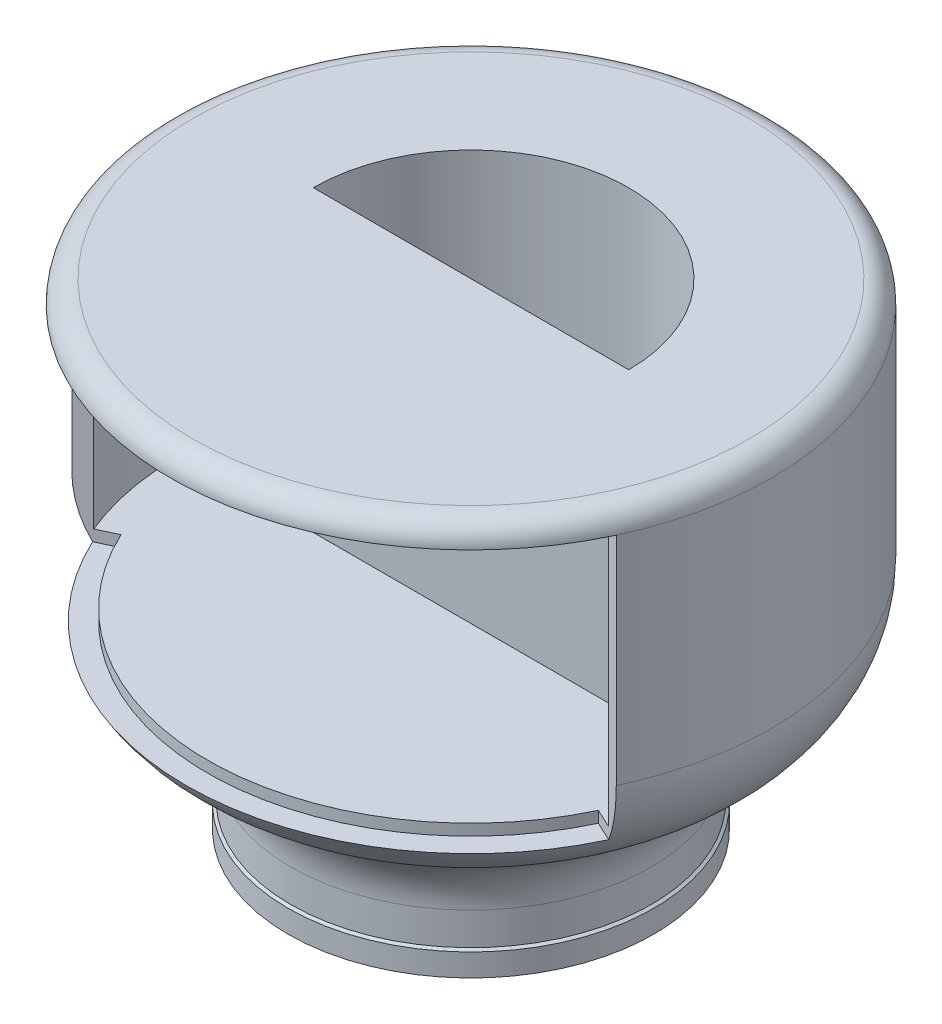
ISO-10303-21;
HEADER;
FILE_DESCRIPTION(('STEP AP214'),'2;1');
FILE_NAME('part.step','',(''),(''),'','','');
FILE_SCHEMA(('AUTOMOTIVE_DESIGN { 1 0 10303 214 1 1 1 1 }'));
ENDSEC;
DATA;
#1=APPLICATION_CONTEXT('core data for automotive mechanical design processes');
#2=APPLICATION_PROTOCOL_DEFINITION('international standard','automotive_design',2000,#1);
#3=PRODUCT_CONTEXT('',#1,'mechanical');
#4=PRODUCT('Part','Part','',(#3));
#5=PRODUCT_RELATED_PRODUCT_CATEGORY('part','',(#4));
#6=PRODUCT_DEFINITION_FORMATION('','',#4);
#7=PRODUCT_DEFINITION_CONTEXT('part definition',#1,'design');
#8=PRODUCT_DEFINITION('design','',#6,#7);
#9=PRODUCT_DEFINITION_SHAPE('','',#8);
#10=(LENGTH_UNIT() NAMED_UNIT(*) SI_UNIT(.MILLI.,.METRE.));
#11=(NAMED_UNIT(*) PLANE_ANGLE_UNIT() SI_UNIT($,.RADIAN.));
#12=(NAMED_UNIT(*) SI_UNIT($,.STERADIAN.) SOLID_ANGLE_UNIT());
#13=UNCERTAINTY_MEASURE_WITH_UNIT(LENGTH_MEASURE(1.E-05),#10,'distance_accuracy_value','');
#14=(GEOMETRIC_REPRESENTATION_CONTEXT(3) GLOBAL_UNCERTAINTY_ASSIGNED_CONTEXT((#13)) GLOBAL_UNIT_ASSIGNED_CONTEXT((#10,
#11,#12)) REPRESENTATION_CONTEXT('',''));
#15=CARTESIAN_POINT('',(0.,0.,0.));
#16=DIRECTION('',(0.,0.,1.));
#17=DIRECTION('',(1.,0.,0.));
#18=AXIS2_PLACEMENT_3D('',#15,#16,#17);
#19=CARTESIAN_POINT('',(0.,31.5562889655761,0.));
#20=DIRECTION('',(0.,-1.,0.));
#21=DIRECTION('',(0.,0.,-1.));
#22=AXIS2_PLACEMENT_3D('',#19,#20,#21);
#23=TOROIDAL_SURFACE('',#22,25.,15.);
#24=CARTESIAN_POINT('',(0.,18.9896485668923,0.));
#25=DIRECTION('',(0.,-1.,0.));
#26=DIRECTION('',(0.,0.,-1.));
#27=AXIS2_PLACEMENT_3D('',#24,#25,#26);
#28=CIRCLE('',#27,33.1902105644586);
#29=CARTESIAN_POINT('',(0.,18.9896485668923,-33.1902105644586));
#30=VERTEX_POINT('',#29);
#31=EDGE_CURVE('E245',#30,#30,#28,.T.);
#32=ORIENTED_EDGE('',*,*,#31,.F.);
#33=EDGE_LOOP('',(#32));
#34=FACE_BOUND('',#33,.T.);
#35=CARTESIAN_POINT('',(0.,31.5562889655761,0.));
#36=DIRECTION('',(0.,-1.,0.));
#37=DIRECTION('',(0.,0.,-1.));
#38=AXIS2_PLACEMENT_3D('',#35,#36,#37);
#39=CIRCLE('',#38,40.);
#40=CARTESIAN_POINT('',(-36.2523114814661,31.5562889655761,16.9047304696279));
#41=VERTEX_POINT('',#40);
#42=CARTESIAN_POINT('',(36.252311481466,31.5562889655761,16.9047304696279));
#43=VERTEX_POINT('',#42);
#44=EDGE_CURVE('E249',#41,#43,#39,.T.);
#45=ORIENTED_EDGE('',*,*,#44,.T.);
#46=CARTESIAN_POINT('',(22.6576946759163,31.5562889655761,10.5654565435174));
#47=DIRECTION('',(-0.422618261740697,0.,0.906307787036651));
#48=DIRECTION('',(0.906307787036651,0.,0.422618261740697));
#49=AXIS2_PLACEMENT_3D('',#46,#47,#48);
#50=CIRCLE('',#49,15.);
#51=CARTESIAN_POINT('',(34.3630138459412,23.9278760968653,16.0237365136485));
#52=VERTEX_POINT('',#51);
#53=EDGE_CURVE('E174',#43,#52,#50,.F.);
#54=ORIENTED_EDGE('',*,*,#53,.T.);
#55=CARTESIAN_POINT('',(0.,23.9278760968653,0.));
#56=DIRECTION('',(0.,-1.,0.));
#57=DIRECTION('',(0.,0.,-1.));
#58=AXIS2_PLACEMENT_3D('',#55,#56,#57);
#59=CIRCLE('',#58,37.9153907066139);
#60=CARTESIAN_POINT('',(-34.3630138459412,23.9278760968653,16.0237365136485));
#61=VERTEX_POINT('',#60);
#62=EDGE_CURVE('E11',#61,#52,#59,.F.);
#63=ORIENTED_EDGE('',*,*,#62,.F.);
#64=CARTESIAN_POINT('',(-22.6576946759163,31.5562889655761,10.5654565435174));
#65=DIRECTION('',(-0.422618261740697,0.,-0.906307787036651));
#66=DIRECTION('',(-0.906307787036651,0.,0.422618261740697));
#67=AXIS2_PLACEMENT_3D('',#64,#65,#66);
#68=CIRCLE('',#67,15.);
#69=EDGE_CURVE('E145',#41,#61,#68,.F.);
#70=ORIENTED_EDGE('',*,*,#69,.F.);
#71=EDGE_LOOP('',(#45,#54,#63,#70));
#72=FACE_BOUND('',#71,.T.);
#73=ADVANCED_FACE('F41',(#34,#72),#23,.T.);
#74=CARTESIAN_POINT('',(0.,0.,0.));
#75=DIRECTION('',(0.,-1.,0.));
#76=DIRECTION('',(0.,0.,-1.));
#77=AXIS2_PLACEMENT_3D('',#74,#75,#76);
#78=CYLINDRICAL_SURFACE('',#77,40.);
#79=CARTESIAN_POINT('',(0.,60.4278760968653,0.));
#80=DIRECTION('',(0.,-1.,0.));
#81=DIRECTION('',(0.,0.,-1.));
#82=AXIS2_PLACEMENT_3D('',#79,#80,#81);
#83=CIRCLE('',#82,40.);
#84=CARTESIAN_POINT('',(-36.252311481466,60.4278760968653,16.9047304696279));
#85=VERTEX_POINT('',#84);
#86=CARTESIAN_POINT('',(36.252311481466,60.4278760968653,16.9047304696279));
#87=VERTEX_POINT('',#86);
#88=EDGE_CURVE('E253',#85,#87,#83,.T.);
#89=ORIENTED_EDGE('',*,*,#88,.T.);
#90=DIRECTION('',(0.,-1.,0.));
#91=VECTOR('',#90,1.);
#92=CARTESIAN_POINT('',(36.252311481466,0.,16.9047304696279));
#93=LINE('',#92,#91);
#94=EDGE_CURVE('E170',#87,#43,#93,.T.);
#95=ORIENTED_EDGE('',*,*,#94,.T.);
#96=ORIENTED_EDGE('',*,*,#44,.F.);
#97=DIRECTION('',(0.,-1.,0.));
#98=VECTOR('',#97,1.);
#99=CARTESIAN_POINT('',(-36.2523114814661,0.,16.9047304696279));
#100=LINE('',#99,#98);
#101=EDGE_CURVE('E161',#85,#41,#100,.T.);
#102=ORIENTED_EDGE('',*,*,#101,.F.);
#103=EDGE_LOOP('',(#89,#95,#96,#102));
#104=FACE_BOUND('',#103,.T.);
#105=ADVANCED_FACE('F302',(#104),#78,.T.);
#106=CARTESIAN_POINT('',(0.,0.,0.));
#107=DIRECTION('',(0.,-1.,0.));
#108=DIRECTION('',(0.,0.,-1.));
#109=AXIS2_PLACEMENT_3D('',#106,#107,#108);
#110=CYLINDRICAL_SURFACE('',#109,22.5);
#111=CARTESIAN_POINT('',(0.,0.,0.));
#112=DIRECTION('',(0.,-1.,0.));
#113=DIRECTION('',(0.,0.,-1.));
#114=AXIS2_PLACEMENT_3D('',#111,#112,#113);
#115=CIRCLE('',#114,22.5);
#116=CARTESIAN_POINT('',(0.,0.,-22.5));
#117=VERTEX_POINT('',#116);
#118=EDGE_CURVE('E218',#117,#117,#115,.T.);
#119=ORIENTED_EDGE('',*,*,#118,.T.);
#120=EDGE_LOOP('',(#119));
#121=FACE_BOUND('',#120,.T.);
#122=CARTESIAN_POINT('',(0.,12.5,0.));
#123=DIRECTION('',(0.,-1.,0.));
#124=DIRECTION('',(0.,0.,-1.));
#125=AXIS2_PLACEMENT_3D('',#122,#123,#124);
#126=CIRCLE('',#125,22.5);
#127=CARTESIAN_POINT('',(0.,12.5,-22.5));
#128=VERTEX_POINT('',#127);
#129=EDGE_CURVE('E265',#128,#128,#126,.T.);
#130=ORIENTED_EDGE('',*,*,#129,.F.);
#131=EDGE_LOOP('',(#130));
#132=FACE_BOUND('',#131,.T.);
#133=ADVANCED_FACE('F43',(#121,#132),#110,.F.);
#134=CARTESIAN_POINT('',(0.,12.5,0.));
#135=DIRECTION('',(0.,-1.,0.));
#136=DIRECTION('',(0.,0.,-1.));
#137=AXIS2_PLACEMENT_3D('',#134,#135,#136);
#138=TOROIDAL_SURFACE('',#137,22.,0.5);
#139=ORIENTED_EDGE('',*,*,#129,.T.);
#140=EDGE_LOOP('',(#139));
#141=FACE_BOUND('',#140,.T.);
#142=CARTESIAN_POINT('',(0.,13.,0.));
#143=DIRECTION('',(0.,-1.,0.));
#144=DIRECTION('',(0.,0.,-1.));
#145=AXIS2_PLACEMENT_3D('',#142,#143,#144);
#146=CIRCLE('',#145,22.);
#147=CARTESIAN_POINT('',(0.,13.,-22.));
#148=VERTEX_POINT('',#147);
#149=EDGE_CURVE('E261',#148,#148,#146,.T.);
#150=ORIENTED_EDGE('',*,*,#149,.F.);
#151=EDGE_LOOP('',(#150));
#152=FACE_BOUND('',#151,.T.);
#153=ADVANCED_FACE('F488',(#141,#152),#138,.F.);
#154=CARTESIAN_POINT('',(0.,13.,0.));
#155=DIRECTION('',(0.,-1.,0.));
#156=DIRECTION('',(0.,0.,-1.));
#157=AXIS2_PLACEMENT_3D('',#154,#155,#156);
#158=PLANE('',#157);
#159=CARTESIAN_POINT('',(0.,13.,0.));
#160=DIRECTION('',(0.,-1.,0.));
#161=DIRECTION('',(0.,0.,1.));
#162=AXIS2_PLACEMENT_3D('',#159,#160,#161);
#163=CIRCLE('',#162,21.);
#164=CARTESIAN_POINT('',(-21.,13.,0.));
#165=VERTEX_POINT('',#164);
#166=CARTESIAN_POINT('',(21.,13.,0.));
#167=VERTEX_POINT('',#166);
#168=EDGE_CURVE('E207',#165,#167,#163,.T.);
#169=ORIENTED_EDGE('',*,*,#168,.F.);
#170=DIRECTION('',(-1.,0.,0.));
#171=VECTOR('',#170,1.);
#172=CARTESIAN_POINT('',(21.,13.,0.));
#173=LINE('',#172,#171);
#174=EDGE_CURVE('E210',#167,#165,#173,.T.);
#175=ORIENTED_EDGE('',*,*,#174,.F.);
#176=EDGE_LOOP('',(#169,#175));
#177=FACE_BOUND('',#176,.T.);
#178=ORIENTED_EDGE('',*,*,#149,.T.);
#179=EDGE_LOOP('',(#178));
#180=FACE_BOUND('',#179,.T.);
#181=ADVANCED_FACE('F320',(#177,#180),#158,.T.);
#182=CARTESIAN_POINT('',(0.,63.4278760968653,0.));
#183=DIRECTION('',(0.,1.,0.));
#184=DIRECTION('',(0.,0.,1.));
#185=AXIS2_PLACEMENT_3D('',#182,#183,#184);
#186=PLANE('',#185);
#187=CARTESIAN_POINT('',(0.,63.4278760968653,0.));
#188=DIRECTION('',(0.,1.,0.));
#189=DIRECTION('',(0.,0.,1.));
#190=AXIS2_PLACEMENT_3D('',#187,#188,#189);
#191=CIRCLE('',#190,21.);
#192=CARTESIAN_POINT('',(21.,63.4278760968653,0.));
#193=VERTEX_POINT('',#192);
#194=CARTESIAN_POINT('',(-21.,63.4278760968653,0.));
#195=VERTEX_POINT('',#194);
#196=EDGE_CURVE('E272',#193,#195,#191,.T.);
#197=ORIENTED_EDGE('',*,*,#196,.F.);
#198=DIRECTION('',(1.,0.,0.));
#199=VECTOR('',#198,1.);
#200=CARTESIAN_POINT('',(0.,63.4278760968653,0.));
#201=LINE('',#200,#199);
#202=EDGE_CURVE('E269',#195,#193,#201,.T.);
#203=ORIENTED_EDGE('',*,*,#202,.F.);
#204=EDGE_LOOP('',(#197,#203));
#205=FACE_BOUND('',#204,.T.);
#206=CARTESIAN_POINT('',(0.,63.4278760968653,0.));
#207=DIRECTION('',(0.,-1.,0.));
#208=DIRECTION('',(0.,0.,-1.));
#209=AXIS2_PLACEMENT_3D('',#206,#207,#208);
#210=CIRCLE('',#209,37.);
#211=CARTESIAN_POINT('',(0.,63.4278760968653,-37.));
#212=VERTEX_POINT('',#211);
#213=EDGE_CURVE('E257',#212,#212,#210,.T.);
#214=ORIENTED_EDGE('',*,*,#213,.F.);
#215=EDGE_LOOP('',(#214));
#216=FACE_BOUND('',#215,.T.);
#217=ADVANCED_FACE('F310',(#205,#216),#186,.T.);
#218=CARTESIAN_POINT('',(0.,60.4278760968653,0.));
#219=DIRECTION('',(0.,-1.,0.));
#220=DIRECTION('',(0.,0.,-1.));
#221=AXIS2_PLACEMENT_3D('',#218,#219,#220);
#222=TOROIDAL_SURFACE('',#221,37.,3.);
#223=ORIENTED_EDGE('',*,*,#213,.T.);
#224=EDGE_LOOP('',(#223));
#225=FACE_BOUND('',#224,.T.);
#226=EDGE_CURVE('E254',#87,#85,#83,.T.);
#227=ORIENTED_EDGE('',*,*,#226,.F.);
#228=ORIENTED_EDGE('',*,*,#88,.F.);
#229=EDGE_LOOP('',(#227,#228));
#230=FACE_BOUND('',#229,.T.);
#231=ADVANCED_FACE('F307',(#225,#230),#222,.T.);
#232=CARTESIAN_POINT('',(0.,15.9588183533154,0.));
#233=DIRECTION('',(0.,1.,0.));
#234=DIRECTION('',(0.,0.,1.));
#235=AXIS2_PLACEMENT_3D('',#232,#233,#234);
#236=CONICAL_SURFACE('',#235,28.5398596236943,0.993197296529964);
#237=ORIENTED_EDGE('',*,*,#31,.T.);
#238=EDGE_LOOP('',(#237));
#239=FACE_BOUND('',#238,.T.);
#240=CARTESIAN_POINT('',(0.,15.9588183533154,0.));
#241=DIRECTION('',(0.,-1.,0.));
#242=DIRECTION('',(0.,0.,-1.));
#243=AXIS2_PLACEMENT_3D('',#240,#241,#242);
#244=CIRCLE('',#243,28.5398596236943);
#245=CARTESIAN_POINT('',(0.,15.9588183533154,-28.5398596236943));
#246=VERTEX_POINT('',#245);
#247=EDGE_CURVE('E241',#246,#246,#244,.T.);
#248=ORIENTED_EDGE('',*,*,#247,.F.);
#249=EDGE_LOOP('',(#248));
#250=FACE_BOUND('',#249,.T.);
#251=ADVANCED_FACE('F309',(#239,#250),#236,.T.);
#252=CARTESIAN_POINT('',(0.,7.58105808752617,0.));
#253=DIRECTION('',(0.,-1.,0.));
#254=DIRECTION('',(0.,0.,-1.));
#255=AXIS2_PLACEMENT_3D('',#252,#253,#254);
#256=TOROIDAL_SURFACE('',#255,34.,10.);
#257=ORIENTED_EDGE('',*,*,#247,.T.);
#258=EDGE_LOOP('',(#257));
#259=FACE_BOUND('',#258,.T.);
#260=CARTESIAN_POINT('',(0.,7.58105808752612,0.));
#261=DIRECTION('',(0.,-1.,0.));
#262=DIRECTION('',(0.,0.,-1.));
#263=AXIS2_PLACEMENT_3D('',#260,#261,#262);
#264=CIRCLE('',#263,24.);
#265=CARTESIAN_POINT('',(0.,7.58105808752612,-24.));
#266=VERTEX_POINT('',#265);
#267=EDGE_CURVE('E237',#266,#266,#264,.T.);
#268=ORIENTED_EDGE('',*,*,#267,.F.);
#269=EDGE_LOOP('',(#268));
#270=FACE_BOUND('',#269,.T.);
#271=ADVANCED_FACE('F317',(#259,#270),#256,.F.);
#272=CARTESIAN_POINT('',(0.,0.,0.));
#273=DIRECTION('',(0.,-1.,0.));
#274=DIRECTION('',(0.,0.,-1.));
#275=AXIS2_PLACEMENT_3D('',#272,#273,#274);
#276=CYLINDRICAL_SURFACE('',#275,24.);
#277=ORIENTED_EDGE('',*,*,#267,.T.);
#278=EDGE_LOOP('',(#277));
#279=FACE_BOUND('',#278,.T.);
#280=CARTESIAN_POINT('',(0.,3.25,0.));
#281=DIRECTION('',(0.,-1.,0.));
#282=DIRECTION('',(0.,0.,-1.));
#283=AXIS2_PLACEMENT_3D('',#280,#281,#282);
#284=CIRCLE('',#283,24.);
#285=CARTESIAN_POINT('',(0.,3.25,-24.));
#286=VERTEX_POINT('',#285);
#287=EDGE_CURVE('E233',#286,#286,#284,.T.);
#288=ORIENTED_EDGE('',*,*,#287,.F.);
#289=EDGE_LOOP('',(#288));
#290=FACE_BOUND('',#289,.T.);
#291=ADVANCED_FACE('F334',(#279,#290),#276,.T.);
#292=CARTESIAN_POINT('',(0.,3.,0.));
#293=DIRECTION('',(0.,-1.,0.));
#294=DIRECTION('',(0.,0.,-1.));
#295=AXIS2_PLACEMENT_3D('',#292,#293,#294);
#296=CONICAL_SURFACE('',#295,24.35,0.950546840812071);
#297=ORIENTED_EDGE('',*,*,#287,.T.);
#298=EDGE_LOOP('',(#297));
#299=FACE_BOUND('',#298,.T.);
#300=CARTESIAN_POINT('',(0.,3.,0.));
#301=DIRECTION('',(0.,-1.,0.));
#302=DIRECTION('',(0.,0.,-1.));
#303=AXIS2_PLACEMENT_3D('',#300,#301,#302);
#304=CIRCLE('',#303,24.35);
#305=CARTESIAN_POINT('',(0.,3.,-24.35));
#306=VERTEX_POINT('',#305);
#307=EDGE_CURVE('E229',#306,#306,#304,.T.);
#308=ORIENTED_EDGE('',*,*,#307,.F.);
#309=EDGE_LOOP('',(#308));
#310=FACE_BOUND('',#309,.T.);
#311=ADVANCED_FACE('F338',(#299,#310),#296,.T.);
#312=CARTESIAN_POINT('',(0.,0.,0.));
#313=DIRECTION('',(0.,-1.,0.));
#314=DIRECTION('',(0.,0.,-1.));
#315=AXIS2_PLACEMENT_3D('',#312,#313,#314);
#316=CYLINDRICAL_SURFACE('',#315,24.35);
#317=ORIENTED_EDGE('',*,*,#307,.T.);
#318=EDGE_LOOP('',(#317));
#319=FACE_BOUND('',#318,.T.);
#320=CARTESIAN_POINT('',(0.,0.,0.));
#321=DIRECTION('',(0.,-1.,0.));
#322=DIRECTION('',(0.,0.,-1.));
#323=AXIS2_PLACEMENT_3D('',#320,#321,#322);
#324=CIRCLE('',#323,24.35);
#325=CARTESIAN_POINT('',(0.,0.,-24.35));
#326=VERTEX_POINT('',#325);
#327=EDGE_CURVE('E225',#326,#326,#324,.T.);
#328=ORIENTED_EDGE('',*,*,#327,.F.);
#329=EDGE_LOOP('',(#328));
#330=FACE_BOUND('',#329,.T.);
#331=ADVANCED_FACE('F342',(#319,#330),#316,.T.);
#332=CARTESIAN_POINT('',(22.5,0.,0.));
#333=DIRECTION('',(0.,-1.,0.));
#334=DIRECTION('',(0.,0.,-1.));
#335=AXIS2_PLACEMENT_3D('',#332,#333,#334);
#336=PLANE('',#335);
#337=ORIENTED_EDGE('',*,*,#327,.T.);
#338=EDGE_LOOP('',(#337));
#339=FACE_BOUND('',#338,.T.);
#340=ORIENTED_EDGE('',*,*,#118,.F.);
#341=EDGE_LOOP('',(#340));
#342=FACE_BOUND('',#341,.T.);
#343=ADVANCED_FACE('F346',(#339,#342),#336,.T.);
#344=CARTESIAN_POINT('',(0.,73.,0.));
#345=DIRECTION('',(0.,-1.,0.));
#346=DIRECTION('',(0.,0.,-1.));
#347=AXIS2_PLACEMENT_3D('',#344,#345,#346);
#348=CYLINDRICAL_SURFACE('',#347,21.);
#349=ORIENTED_EDGE('',*,*,#196,.T.);
#350=DIRECTION('',(0.,-1.,0.));
#351=VECTOR('',#350,1.);
#352=CARTESIAN_POINT('',(-21.,73.,0.));
#353=LINE('',#352,#351);
#354=EDGE_CURVE('E215',#195,#165,#353,.T.);
#355=ORIENTED_EDGE('',*,*,#354,.T.);
#356=ORIENTED_EDGE('',*,*,#168,.T.);
#357=DIRECTION('',(0.,-1.,0.));
#358=VECTOR('',#357,1.);
#359=CARTESIAN_POINT('',(21.,73.,0.));
#360=LINE('',#359,#358);
#361=EDGE_CURVE('E214',#193,#167,#360,.T.);
#362=ORIENTED_EDGE('',*,*,#361,.F.);
#363=EDGE_LOOP('',(#349,#355,#356,#362));
#364=FACE_BOUND('',#363,.T.);
#365=ADVANCED_FACE('F350',(#364),#348,.F.);
#366=CARTESIAN_POINT('',(21.,73.,0.));
#367=DIRECTION('',(0.,0.,1.));
#368=DIRECTION('',(1.,0.,0.));
#369=AXIS2_PLACEMENT_3D('',#366,#367,#368);
#370=PLANE('',#369);
#371=ORIENTED_EDGE('',*,*,#202,.T.);
#372=ORIENTED_EDGE('',*,*,#361,.T.);
#373=ORIENTED_EDGE('',*,*,#174,.T.);
#374=ORIENTED_EDGE('',*,*,#354,.F.);
#375=EDGE_LOOP('',(#371,#372,#373,#374));
#376=FACE_BOUND('',#375,.T.);
#377=ADVANCED_FACE('F354',(#376),#370,.F.);
#378=CARTESIAN_POINT('',(0.,0.,0.));
#379=DIRECTION('',(0.,-1.,0.));
#380=DIRECTION('',(0.,0.,-1.));
#381=AXIS2_PLACEMENT_3D('',#378,#379,#380);
#382=CYLINDRICAL_SURFACE('',#381,35.0647158321143);
#383=DIRECTION('',(0.,-1.,0.));
#384=VECTOR('',#383,1.);
#385=CARTESIAN_POINT('',(-31.7794250088725,60.4278760968653,14.8189892533996));
#386=LINE('',#385,#384);
#387=CARTESIAN_POINT('',(-31.7794250088725,25.4278760968653,14.8189892533996));
#388=VERTEX_POINT('',#387);
#389=CARTESIAN_POINT('',(-31.7794250088725,23.9278760968653,14.8189892533996));
#390=VERTEX_POINT('',#389);
#391=EDGE_CURVE('E64',#388,#390,#386,.T.);
#392=ORIENTED_EDGE('',*,*,#391,.T.);
#393=CARTESIAN_POINT('',(0.,23.9278760968653,0.));
#394=DIRECTION('',(0.,-1.,0.));
#395=DIRECTION('',(0.,0.,-1.));
#396=AXIS2_PLACEMENT_3D('',#393,#394,#395);
#397=CIRCLE('',#396,35.0647158321143);
#398=CARTESIAN_POINT('',(31.7794250088725,23.9278760968653,14.8189892533996));
#399=VERTEX_POINT('',#398);
#400=EDGE_CURVE('E125',#399,#390,#397,.T.);
#401=ORIENTED_EDGE('',*,*,#400,.F.);
#402=DIRECTION('',(0.,-1.,0.));
#403=VECTOR('',#402,1.);
#404=CARTESIAN_POINT('',(31.7794250088725,60.4278760968653,14.8189892533996));
#405=LINE('',#404,#403);
#406=CARTESIAN_POINT('',(31.7794250088725,25.4278760968653,14.8189892533996));
#407=VERTEX_POINT('',#406);
#408=EDGE_CURVE('E141',#407,#399,#405,.T.);
#409=ORIENTED_EDGE('',*,*,#408,.F.);
#410=CARTESIAN_POINT('',(0.,25.4278760968653,0.));
#411=DIRECTION('',(0.,-1.,0.));
#412=DIRECTION('',(0.,0.,-1.));
#413=AXIS2_PLACEMENT_3D('',#410,#411,#412);
#414=CIRCLE('',#413,35.0647158321143);
#415=EDGE_CURVE('E128',#388,#407,#414,.F.);
#416=ORIENTED_EDGE('',*,*,#415,.F.);
#417=EDGE_LOOP('',(#392,#401,#409,#416));
#418=FACE_BOUND('',#417,.T.);
#419=ADVANCED_FACE('F123',(#418),#382,.T.);
#420=CARTESIAN_POINT('',(31.7794250088725,23.9278760968653,14.8189892533996));
#421=DIRECTION('',(0.,-1.,0.));
#422=DIRECTION('',(0.,0.,-1.));
#423=AXIS2_PLACEMENT_3D('',#420,#421,#422);
#424=PLANE('',#423);
#425=ORIENTED_EDGE('',*,*,#62,.T.);
#426=DIRECTION('',(0.906307787036651,0.,0.422618261740697));
#427=VECTOR('',#426,1.);
#428=CARTESIAN_POINT('',(31.7794250088725,23.9278760968653,14.8189892533996));
#429=LINE('',#428,#427);
#430=EDGE_CURVE('E131',#399,#52,#429,.T.);
#431=ORIENTED_EDGE('',*,*,#430,.F.);
#432=ORIENTED_EDGE('',*,*,#400,.T.);
#433=DIRECTION('',(-0.906307787036651,0.,0.422618261740697));
#434=VECTOR('',#433,1.);
#435=CARTESIAN_POINT('',(-31.7794250088725,23.9278760968653,14.8189892533996));
#436=LINE('',#435,#434);
#437=EDGE_CURVE('E136',#390,#61,#436,.T.);
#438=ORIENTED_EDGE('',*,*,#437,.T.);
#439=EDGE_LOOP('',(#425,#431,#432,#438));
#440=FACE_BOUND('',#439,.T.);
#441=ADVANCED_FACE('F135',(#440),#424,.F.);
#442=CARTESIAN_POINT('',(42.6551184533123,60.4278760968653,19.890408394288));
#443=DIRECTION('',(0.,1.,0.));
#444=DIRECTION('',(0.,0.,1.));
#445=AXIS2_PLACEMENT_3D('',#442,#443,#444);
#446=PLANE('',#445);
#447=ORIENTED_EDGE('',*,*,#226,.T.);
#448=DIRECTION('',(0.906307787036651,0.,-0.422618261740697));
#449=VECTOR('',#448,1.);
#450=CARTESIAN_POINT('',(-42.6551184533123,60.4278760968653,19.890408394288));
#451=LINE('',#450,#449);
#452=CARTESIAN_POINT('',(-34.2611153849239,60.4278760968653,15.976220480922));
#453=VERTEX_POINT('',#452);
#454=EDGE_CURVE('E57',#85,#453,#451,.T.);
#455=ORIENTED_EDGE('',*,*,#454,.T.);
#456=CARTESIAN_POINT('',(0.,60.4278760968653,1.99999999999999));
#457=DIRECTION('',(0.,1.,0.));
#458=DIRECTION('',(0.,0.,1.));
#459=AXIS2_PLACEMENT_3D('',#456,#457,#458);
#460=CIRCLE('',#459,37.0021454290209);
#461=CARTESIAN_POINT('',(34.2611153849239,60.4278760968653,15.976220480922));
#462=VERTEX_POINT('',#461);
#463=EDGE_CURVE('E50',#453,#462,#460,.T.);
#464=ORIENTED_EDGE('',*,*,#463,.T.);
#465=DIRECTION('',(-0.906307787036651,0.,-0.422618261740697));
#466=VECTOR('',#465,1.);
#467=CARTESIAN_POINT('',(42.6551184533123,60.4278760968653,19.890408394288));
#468=LINE('',#467,#466);
#469=EDGE_CURVE('E153',#87,#462,#468,.T.);
#470=ORIENTED_EDGE('',*,*,#469,.F.);
#471=EDGE_LOOP('',(#447,#455,#464,#470));
#472=FACE_BOUND('',#471,.T.);
#473=ADVANCED_FACE('F287',(#472),#446,.F.);
#474=CARTESIAN_POINT('',(0.,0.,0.));
#475=DIRECTION('',(-0.422618261740697,0.,0.906307787036651));
#476=DIRECTION('',(0.906307787036651,0.,0.422618261740697));
#477=AXIS2_PLACEMENT_3D('',#474,#475,#476);
#478=PLANE('',#477);
#479=ORIENTED_EDGE('',*,*,#94,.F.);
#480=ORIENTED_EDGE('',*,*,#469,.T.);
#481=DIRECTION('',(0.,-1.,0.));
#482=VECTOR('',#481,1.);
#483=CARTESIAN_POINT('',(34.2611153849239,62.4278760968653,15.976220480922));
#484=LINE('',#483,#482);
#485=CARTESIAN_POINT('',(34.2611153849239,25.4278760968653,15.976220480922));
#486=VERTEX_POINT('',#485);
#487=EDGE_CURVE('E166',#486,#462,#484,.F.);
#488=ORIENTED_EDGE('',*,*,#487,.F.);
#489=DIRECTION('',(-0.906307787036651,0.,-0.422618261740697));
#490=VECTOR('',#489,1.);
#491=CARTESIAN_POINT('',(0.766044443118975,25.4278760968653,0.357212390313457));
#492=LINE('',#491,#490);
#493=EDGE_CURVE('E281',#486,#407,#492,.T.);
#494=ORIENTED_EDGE('',*,*,#493,.T.);
#495=ORIENTED_EDGE('',*,*,#408,.T.);
#496=ORIENTED_EDGE('',*,*,#430,.T.);
#497=ORIENTED_EDGE('',*,*,#53,.F.);
#498=EDGE_LOOP('',(#479,#480,#488,#494,#495,#496,#497));
#499=FACE_BOUND('',#498,.T.);
#500=ADVANCED_FACE('F292',(#499),#478,.T.);
#501=CARTESIAN_POINT('',(0.,0.,0.));
#502=DIRECTION('',(-0.422618261740697,0.,-0.906307787036651));
#503=DIRECTION('',(-0.906307787036651,0.,0.422618261740697));
#504=AXIS2_PLACEMENT_3D('',#501,#502,#503);
#505=PLANE('',#504);
#506=ORIENTED_EDGE('',*,*,#69,.T.);
#507=ORIENTED_EDGE('',*,*,#437,.F.);
#508=ORIENTED_EDGE('',*,*,#391,.F.);
#509=DIRECTION('',(0.906307787036651,0.,-0.422618261740697));
#510=VECTOR('',#509,1.);
#511=CARTESIAN_POINT('',(-0.76604444311897,25.4278760968653,0.357212390313454));
#512=LINE('',#511,#510);
#513=CARTESIAN_POINT('',(-34.2611153849239,25.4278760968653,15.976220480922));
#514=VERTEX_POINT('',#513);
#515=EDGE_CURVE('E276',#514,#388,#512,.T.);
#516=ORIENTED_EDGE('',*,*,#515,.F.);
#517=DIRECTION('',(0.,-1.,0.));
#518=VECTOR('',#517,1.);
#519=CARTESIAN_POINT('',(-34.2611153849239,62.4278760968653,15.976220480922));
#520=LINE('',#519,#518);
#521=EDGE_CURVE('E140',#514,#453,#520,.F.);
#522=ORIENTED_EDGE('',*,*,#521,.T.);
#523=ORIENTED_EDGE('',*,*,#454,.F.);
#524=ORIENTED_EDGE('',*,*,#101,.T.);
#525=EDGE_LOOP('',(#506,#507,#508,#516,#522,#523,#524));
#526=FACE_BOUND('',#525,.T.);
#527=ADVANCED_FACE('F143',(#526),#505,.F.);
#528=CARTESIAN_POINT('',(0.,62.4278760968653,1.99999999999999));
#529=DIRECTION('',(0.,-1.,0.));
#530=DIRECTION('',(0.,0.,-1.));
#531=AXIS2_PLACEMENT_3D('',#528,#529,#530);
#532=PLANE('',#531);
#533=CARTESIAN_POINT('',(0.,62.4278760968653,1.99999999999999));
#534=DIRECTION('',(0.,1.,0.));
#535=DIRECTION('',(0.,0.,-1.));
#536=AXIS2_PLACEMENT_3D('',#533,#534,#535);
#537=CIRCLE('',#536,37.0021454290209);
#538=CARTESIAN_POINT('',(0.,62.4278760968653,-35.0021454290209));
#539=VERTEX_POINT('',#538);
#540=EDGE_CURVE('E203',#539,#539,#537,.T.);
#541=ORIENTED_EDGE('',*,*,#540,.F.);
#542=EDGE_LOOP('',(#541));
#543=FACE_BOUND('',#542,.T.);
#544=CARTESIAN_POINT('',(0.,62.4278760968653,0.0603276848234887));
#545=DIRECTION('',(0.,1.,0.));
#546=DIRECTION('',(0.,0.,-1.));
#547=AXIS2_PLACEMENT_3D('',#544,#545,#546);
#548=CIRCLE('',#547,24.0603276848235);
#549=CARTESIAN_POINT('',(24.,62.4278760968653,1.76308083812649));
#550=VERTEX_POINT('',#549);
#551=CARTESIAN_POINT('',(-24.,62.4278760968653,1.76308083812649));
#552=VERTEX_POINT('',#551);
#553=EDGE_CURVE('E190',#550,#552,#548,.T.);
#554=ORIENTED_EDGE('',*,*,#553,.T.);
#555=DIRECTION('',(1.,0.,0.));
#556=VECTOR('',#555,1.);
#557=CARTESIAN_POINT('',(-24.,62.4278760968653,1.76308083812649));
#558=LINE('',#557,#556);
#559=EDGE_CURVE('E194',#552,#550,#558,.T.);
#560=ORIENTED_EDGE('',*,*,#559,.T.);
#561=EDGE_LOOP('',(#554,#560));
#562=FACE_BOUND('',#561,.T.);
#563=ADVANCED_FACE('F362',(#543,#562),#532,.T.);
#564=CARTESIAN_POINT('',(-24.,62.4278760968653,1.76308083812649));
#565=DIRECTION('',(0.,0.,-1.));
#566=DIRECTION('',(-1.,0.,0.));
#567=AXIS2_PLACEMENT_3D('',#564,#565,#566);
#568=PLANE('',#567);
#569=DIRECTION('',(0.,-1.,0.));
#570=VECTOR('',#569,1.);
#571=CARTESIAN_POINT('',(24.,62.4278760968653,1.76308083812649));
#572=LINE('',#571,#570);
#573=CARTESIAN_POINT('',(24.,25.4278760968653,1.76308083812649));
#574=VERTEX_POINT('',#573);
#575=EDGE_CURVE('E197',#550,#574,#572,.T.);
#576=ORIENTED_EDGE('',*,*,#575,.F.);
#577=ORIENTED_EDGE('',*,*,#559,.F.);
#578=DIRECTION('',(0.,-1.,0.));
#579=VECTOR('',#578,1.);
#580=CARTESIAN_POINT('',(-24.,62.4278760968653,1.76308083812649));
#581=LINE('',#580,#579);
#582=CARTESIAN_POINT('',(-24.,25.4278760968653,1.76308083812649));
#583=VERTEX_POINT('',#582);
#584=EDGE_CURVE('E200',#552,#583,#581,.T.);
#585=ORIENTED_EDGE('',*,*,#584,.T.);
#586=DIRECTION('',(1.,0.,0.));
#587=VECTOR('',#586,1.);
#588=CARTESIAN_POINT('',(-24.,25.4278760968653,1.76308083812649));
#589=LINE('',#588,#587);
#590=EDGE_CURVE('E182',#583,#574,#589,.T.);
#591=ORIENTED_EDGE('',*,*,#590,.T.);
#592=EDGE_LOOP('',(#576,#577,#585,#591));
#593=FACE_BOUND('',#592,.T.);
#594=ADVANCED_FACE('F365',(#593),#568,.F.);
#595=CARTESIAN_POINT('',(0.,62.4278760968653,0.0603276848234887));
#596=DIRECTION('',(0.,-1.,0.));
#597=DIRECTION('',(0.,0.,-1.));
#598=AXIS2_PLACEMENT_3D('',#595,#596,#597);
#599=CYLINDRICAL_SURFACE('',#598,24.0603276848235);
#600=ORIENTED_EDGE('',*,*,#584,.F.);
#601=ORIENTED_EDGE('',*,*,#553,.F.);
#602=ORIENTED_EDGE('',*,*,#575,.T.);
#603=CARTESIAN_POINT('',(0.,25.4278760968653,0.0603276848234887));
#604=DIRECTION('',(0.,1.,0.));
#605=DIRECTION('',(0.,0.,-1.));
#606=AXIS2_PLACEMENT_3D('',#603,#604,#605);
#607=CIRCLE('',#606,24.0603276848235);
#608=EDGE_CURVE('E178',#574,#583,#607,.T.);
#609=ORIENTED_EDGE('',*,*,#608,.T.);
#610=EDGE_LOOP('',(#600,#601,#602,#609));
#611=FACE_BOUND('',#610,.T.);
#612=ADVANCED_FACE('F367',(#611),#599,.T.);
#613=CARTESIAN_POINT('',(0.,25.4278760968653,1.99999999999999));
#614=DIRECTION('',(0.,-1.,0.));
#615=DIRECTION('',(0.,0.,-1.));
#616=AXIS2_PLACEMENT_3D('',#613,#614,#615);
#617=PLANE('',#616);
#618=ORIENTED_EDGE('',*,*,#608,.F.);
#619=ORIENTED_EDGE('',*,*,#590,.F.);
#620=EDGE_LOOP('',(#618,#619));
#621=FACE_BOUND('',#620,.T.);
#622=ORIENTED_EDGE('',*,*,#493,.F.);
#623=CARTESIAN_POINT('',(0.,25.4278760968653,1.99999999999999));
#624=DIRECTION('',(0.,1.,0.));
#625=DIRECTION('',(0.,0.,-1.));
#626=AXIS2_PLACEMENT_3D('',#623,#624,#625);
#627=CIRCLE('',#626,37.0021454290209);
#628=EDGE_CURVE('E186',#486,#514,#627,.T.);
#629=ORIENTED_EDGE('',*,*,#628,.T.);
#630=ORIENTED_EDGE('',*,*,#515,.T.);
#631=ORIENTED_EDGE('',*,*,#415,.T.);
#632=EDGE_LOOP('',(#622,#629,#630,#631));
#633=FACE_BOUND('',#632,.T.);
#634=ADVANCED_FACE('F297',(#621,#633),#617,.F.);
#635=CARTESIAN_POINT('',(0.,62.4278760968653,1.99999999999999));
#636=DIRECTION('',(0.,-1.,0.));
#637=DIRECTION('',(0.,0.,-1.));
#638=AXIS2_PLACEMENT_3D('',#635,#636,#637);
#639=CYLINDRICAL_SURFACE('',#638,37.0021454290209);
#640=ORIENTED_EDGE('',*,*,#540,.T.);
#641=EDGE_LOOP('',(#640));
#642=FACE_BOUND('',#641,.T.);
#643=ORIENTED_EDGE('',*,*,#628,.F.);
#644=ORIENTED_EDGE('',*,*,#487,.T.);
#645=ORIENTED_EDGE('',*,*,#463,.F.);
#646=ORIENTED_EDGE('',*,*,#521,.F.);
#647=EDGE_LOOP('',(#643,#644,#645,#646));
#648=FACE_BOUND('',#647,.T.);
#649=ADVANCED_FACE('F295',(#642,#648),#639,.F.);
#650=CLOSED_SHELL('',(#73,#105,#133,#153,#181,#217,#231,#251,#271,#291,#311,#331,#343,#365,#377,
#419,#441,#473,#500,#527,#563,#594,#612,#634,#649));
#651=MANIFOLD_SOLID_BREP('B2',#650);
#652=ADVANCED_BREP_SHAPE_REPRESENTATION('',(#18,#651),#14);
#653=SHAPE_DEFINITION_REPRESENTATION(#9,#652);
ENDSEC;
END-ISO-10303-21;
